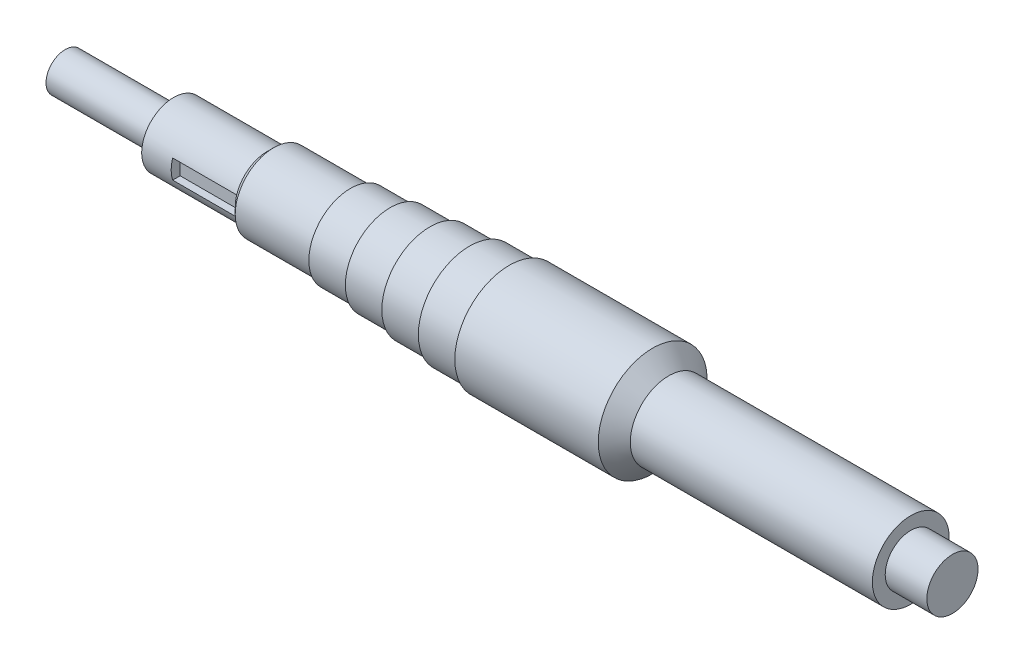
ISO-10303-21;
HEADER;
FILE_DESCRIPTION(('STEP AP214'),'2;1');
FILE_NAME('part.step','',(''),(''),'','','');
FILE_SCHEMA(('AUTOMOTIVE_DESIGN { 1 0 10303 214 1 1 1 1 }'));
ENDSEC;
DATA;
#1=APPLICATION_CONTEXT('core data for automotive mechanical design processes');
#2=APPLICATION_PROTOCOL_DEFINITION('international standard','automotive_design',2000,#1);
#3=PRODUCT_CONTEXT('',#1,'mechanical');
#4=PRODUCT('Part','Part','',(#3));
#5=PRODUCT_RELATED_PRODUCT_CATEGORY('part','',(#4));
#6=PRODUCT_DEFINITION_FORMATION('','',#4);
#7=PRODUCT_DEFINITION_CONTEXT('part definition',#1,'design');
#8=PRODUCT_DEFINITION('design','',#6,#7);
#9=PRODUCT_DEFINITION_SHAPE('','',#8);
#10=(LENGTH_UNIT() NAMED_UNIT(*) SI_UNIT(.MILLI.,.METRE.));
#11=(NAMED_UNIT(*) PLANE_ANGLE_UNIT() SI_UNIT($,.RADIAN.));
#12=(NAMED_UNIT(*) SI_UNIT($,.STERADIAN.) SOLID_ANGLE_UNIT());
#13=UNCERTAINTY_MEASURE_WITH_UNIT(LENGTH_MEASURE(1.E-05),#10,'distance_accuracy_value','');
#14=(GEOMETRIC_REPRESENTATION_CONTEXT(3) GLOBAL_UNCERTAINTY_ASSIGNED_CONTEXT((#13)) GLOBAL_UNIT_ASSIGNED_CONTEXT((#10,
#11,#12)) REPRESENTATION_CONTEXT('',''));
#15=CARTESIAN_POINT('',(0.,0.,0.));
#16=DIRECTION('',(0.,0.,1.));
#17=DIRECTION('',(1.,0.,0.));
#18=AXIS2_PLACEMENT_3D('',#15,#16,#17);
#19=CARTESIAN_POINT('',(31.55,0.,0.));
#20=DIRECTION('',(1.,0.,0.));
#21=DIRECTION('',(0.,0.,-1.));
#22=AXIS2_PLACEMENT_3D('',#19,#20,#21);
#23=CONICAL_SURFACE('',#22,4.99999999999999,0.78539816339745);
#24=CARTESIAN_POINT('',(32.55,0.,0.));
#25=DIRECTION('',(-1.,0.,0.));
#26=DIRECTION('',(0.,0.,1.));
#27=AXIS2_PLACEMENT_3D('',#24,#25,#26);
#28=CIRCLE('',#27,6.);
#29=CARTESIAN_POINT('',(32.55,0.,6.));
#30=VERTEX_POINT('',#29);
#31=EDGE_CURVE('E199',#30,#30,#28,.T.);
#32=ORIENTED_EDGE('',*,*,#31,.T.);
#33=EDGE_LOOP('',(#32));
#34=FACE_BOUND('',#33,.T.);
#35=CARTESIAN_POINT('',(31.55,0.,0.));
#36=DIRECTION('',(-1.,0.,0.));
#37=DIRECTION('',(0.,0.,1.));
#38=AXIS2_PLACEMENT_3D('',#35,#36,#37);
#39=CIRCLE('',#38,4.99999999999999);
#40=CARTESIAN_POINT('',(31.55,-1.50000000000001,4.76969600708471));
#41=VERTEX_POINT('',#40);
#42=CARTESIAN_POINT('',(31.55,1.49999999999999,4.76969600708472));
#43=VERTEX_POINT('',#42);
#44=EDGE_CURVE('E124',#41,#43,#39,.T.);
#45=ORIENTED_EDGE('',*,*,#44,.F.);
#46=EDGE_CURVE('E118',#43,#41,#39,.T.);
#47=ORIENTED_EDGE('',*,*,#46,.F.);
#48=EDGE_LOOP('',(#45,#47));
#49=FACE_BOUND('',#48,.T.);
#50=ADVANCED_FACE('F45',(#34,#49),#23,.T.);
#51=CARTESIAN_POINT('',(0.,0.,0.));
#52=DIRECTION('',(-1.,0.,0.));
#53=DIRECTION('',(0.,0.,1.));
#54=AXIS2_PLACEMENT_3D('',#51,#52,#53);
#55=CYLINDRICAL_SURFACE('',#54,6.);
#56=CARTESIAN_POINT('',(44.55,0.,0.));
#57=DIRECTION('',(-1.,0.,0.));
#58=DIRECTION('',(0.,0.,1.));
#59=AXIS2_PLACEMENT_3D('',#56,#57,#58);
#60=CIRCLE('',#59,6.);
#61=CARTESIAN_POINT('',(44.55,0.,6.));
#62=VERTEX_POINT('',#61);
#63=EDGE_CURVE('E195',#62,#62,#60,.T.);
#64=ORIENTED_EDGE('',*,*,#63,.T.);
#65=EDGE_LOOP('',(#64));
#66=FACE_BOUND('',#65,.T.);
#67=ORIENTED_EDGE('',*,*,#31,.F.);
#68=EDGE_LOOP('',(#67));
#69=FACE_BOUND('',#68,.T.);
#70=ADVANCED_FACE('F225',(#66,#69),#55,.T.);
#71=CARTESIAN_POINT('',(44.55,6.,0.));
#72=DIRECTION('',(-1.,0.,0.));
#73=DIRECTION('',(0.,0.,1.));
#74=AXIS2_PLACEMENT_3D('',#71,#72,#73);
#75=PLANE('',#74);
#76=CARTESIAN_POINT('',(44.55,0.,0.));
#77=DIRECTION('',(-1.,0.,0.));
#78=DIRECTION('',(0.,0.,1.));
#79=AXIS2_PLACEMENT_3D('',#76,#77,#78);
#80=CIRCLE('',#79,6.5);
#81=CARTESIAN_POINT('',(44.55,0.,6.5));
#82=VERTEX_POINT('',#81);
#83=EDGE_CURVE('E191',#82,#82,#80,.T.);
#84=ORIENTED_EDGE('',*,*,#83,.T.);
#85=EDGE_LOOP('',(#84));
#86=FACE_BOUND('',#85,.T.);
#87=ORIENTED_EDGE('',*,*,#63,.F.);
#88=EDGE_LOOP('',(#87));
#89=FACE_BOUND('',#88,.T.);
#90=ADVANCED_FACE('F232',(#86,#89),#75,.T.);
#91=CARTESIAN_POINT('',(0.,0.,0.));
#92=DIRECTION('',(-1.,0.,0.));
#93=DIRECTION('',(0.,0.,1.));
#94=AXIS2_PLACEMENT_3D('',#91,#92,#93);
#95=CYLINDRICAL_SURFACE('',#94,6.5);
#96=CARTESIAN_POINT('',(50.75,0.,0.));
#97=DIRECTION('',(-1.,0.,0.));
#98=DIRECTION('',(0.,0.,1.));
#99=AXIS2_PLACEMENT_3D('',#96,#97,#98);
#100=CIRCLE('',#99,6.5);
#101=CARTESIAN_POINT('',(50.75,0.,6.5));
#102=VERTEX_POINT('',#101);
#103=EDGE_CURVE('E187',#102,#102,#100,.T.);
#104=ORIENTED_EDGE('',*,*,#103,.T.);
#105=EDGE_LOOP('',(#104));
#106=FACE_BOUND('',#105,.T.);
#107=ORIENTED_EDGE('',*,*,#83,.F.);
#108=EDGE_LOOP('',(#107));
#109=FACE_BOUND('',#108,.T.);
#110=ADVANCED_FACE('F239',(#106,#109),#95,.T.);
#111=CARTESIAN_POINT('',(50.75,6.5,0.));
#112=DIRECTION('',(-1.,0.,0.));
#113=DIRECTION('',(0.,0.,1.));
#114=AXIS2_PLACEMENT_3D('',#111,#112,#113);
#115=PLANE('',#114);
#116=CARTESIAN_POINT('',(50.75,0.,0.));
#117=DIRECTION('',(-1.,0.,0.));
#118=DIRECTION('',(0.,0.,1.));
#119=AXIS2_PLACEMENT_3D('',#116,#117,#118);
#120=CIRCLE('',#119,7.);
#121=CARTESIAN_POINT('',(50.75,0.,7.));
#122=VERTEX_POINT('',#121);
#123=EDGE_CURVE('E183',#122,#122,#120,.T.);
#124=ORIENTED_EDGE('',*,*,#123,.T.);
#125=EDGE_LOOP('',(#124));
#126=FACE_BOUND('',#125,.T.);
#127=ORIENTED_EDGE('',*,*,#103,.F.);
#128=EDGE_LOOP('',(#127));
#129=FACE_BOUND('',#128,.T.);
#130=ADVANCED_FACE('F245',(#126,#129),#115,.T.);
#131=CARTESIAN_POINT('',(0.,0.,0.));
#132=DIRECTION('',(-1.,0.,0.));
#133=DIRECTION('',(0.,0.,1.));
#134=AXIS2_PLACEMENT_3D('',#131,#132,#133);
#135=CYLINDRICAL_SURFACE('',#134,7.);
#136=CARTESIAN_POINT('',(56.95,0.,0.));
#137=DIRECTION('',(-1.,0.,0.));
#138=DIRECTION('',(0.,0.,1.));
#139=AXIS2_PLACEMENT_3D('',#136,#137,#138);
#140=CIRCLE('',#139,7.);
#141=CARTESIAN_POINT('',(56.95,0.,7.));
#142=VERTEX_POINT('',#141);
#143=EDGE_CURVE('E179',#142,#142,#140,.T.);
#144=ORIENTED_EDGE('',*,*,#143,.T.);
#145=EDGE_LOOP('',(#144));
#146=FACE_BOUND('',#145,.T.);
#147=ORIENTED_EDGE('',*,*,#123,.F.);
#148=EDGE_LOOP('',(#147));
#149=FACE_BOUND('',#148,.T.);
#150=ADVANCED_FACE('F249',(#146,#149),#135,.T.);
#151=CARTESIAN_POINT('',(56.95,7.,0.));
#152=DIRECTION('',(-1.,0.,0.));
#153=DIRECTION('',(0.,0.,1.));
#154=AXIS2_PLACEMENT_3D('',#151,#152,#153);
#155=PLANE('',#154);
#156=CARTESIAN_POINT('',(56.95,0.,0.));
#157=DIRECTION('',(-1.,0.,0.));
#158=DIRECTION('',(0.,0.,1.));
#159=AXIS2_PLACEMENT_3D('',#156,#157,#158);
#160=CIRCLE('',#159,7.5);
#161=CARTESIAN_POINT('',(56.95,0.,7.5));
#162=VERTEX_POINT('',#161);
#163=EDGE_CURVE('E175',#162,#162,#160,.T.);
#164=ORIENTED_EDGE('',*,*,#163,.T.);
#165=EDGE_LOOP('',(#164));
#166=FACE_BOUND('',#165,.T.);
#167=ORIENTED_EDGE('',*,*,#143,.F.);
#168=EDGE_LOOP('',(#167));
#169=FACE_BOUND('',#168,.T.);
#170=ADVANCED_FACE('F253',(#166,#169),#155,.T.);
#171=CARTESIAN_POINT('',(0.,0.,0.));
#172=DIRECTION('',(-1.,0.,0.));
#173=DIRECTION('',(0.,0.,1.));
#174=AXIS2_PLACEMENT_3D('',#171,#172,#173);
#175=CYLINDRICAL_SURFACE('',#174,7.5);
#176=CARTESIAN_POINT('',(63.15,0.,0.));
#177=DIRECTION('',(-1.,0.,0.));
#178=DIRECTION('',(0.,0.,1.));
#179=AXIS2_PLACEMENT_3D('',#176,#177,#178);
#180=CIRCLE('',#179,7.5);
#181=CARTESIAN_POINT('',(63.15,0.,7.5));
#182=VERTEX_POINT('',#181);
#183=EDGE_CURVE('E171',#182,#182,#180,.T.);
#184=ORIENTED_EDGE('',*,*,#183,.T.);
#185=EDGE_LOOP('',(#184));
#186=FACE_BOUND('',#185,.T.);
#187=ORIENTED_EDGE('',*,*,#163,.F.);
#188=EDGE_LOOP('',(#187));
#189=FACE_BOUND('',#188,.T.);
#190=ADVANCED_FACE('F257',(#186,#189),#175,.T.);
#191=CARTESIAN_POINT('',(63.15,7.5,0.));
#192=DIRECTION('',(-1.,0.,0.));
#193=DIRECTION('',(0.,0.,1.));
#194=AXIS2_PLACEMENT_3D('',#191,#192,#193);
#195=PLANE('',#194);
#196=CARTESIAN_POINT('',(63.15,0.,0.));
#197=DIRECTION('',(-1.,0.,0.));
#198=DIRECTION('',(0.,0.,1.));
#199=AXIS2_PLACEMENT_3D('',#196,#197,#198);
#200=CIRCLE('',#199,8.);
#201=CARTESIAN_POINT('',(63.15,0.,8.));
#202=VERTEX_POINT('',#201);
#203=EDGE_CURVE('E167',#202,#202,#200,.T.);
#204=ORIENTED_EDGE('',*,*,#203,.T.);
#205=EDGE_LOOP('',(#204));
#206=FACE_BOUND('',#205,.T.);
#207=ORIENTED_EDGE('',*,*,#183,.F.);
#208=EDGE_LOOP('',(#207));
#209=FACE_BOUND('',#208,.T.);
#210=ADVANCED_FACE('F261',(#206,#209),#195,.T.);
#211=CARTESIAN_POINT('',(0.,0.,0.));
#212=DIRECTION('',(-1.,0.,0.));
#213=DIRECTION('',(0.,0.,1.));
#214=AXIS2_PLACEMENT_3D('',#211,#212,#213);
#215=CYLINDRICAL_SURFACE('',#214,8.);
#216=CARTESIAN_POINT('',(69.35,0.,0.));
#217=DIRECTION('',(-1.,0.,0.));
#218=DIRECTION('',(0.,0.,1.));
#219=AXIS2_PLACEMENT_3D('',#216,#217,#218);
#220=CIRCLE('',#219,8.);
#221=CARTESIAN_POINT('',(69.35,0.,8.));
#222=VERTEX_POINT('',#221);
#223=EDGE_CURVE('E163',#222,#222,#220,.T.);
#224=ORIENTED_EDGE('',*,*,#223,.T.);
#225=EDGE_LOOP('',(#224));
#226=FACE_BOUND('',#225,.T.);
#227=ORIENTED_EDGE('',*,*,#203,.F.);
#228=EDGE_LOOP('',(#227));
#229=FACE_BOUND('',#228,.T.);
#230=ADVANCED_FACE('F265',(#226,#229),#215,.T.);
#231=CARTESIAN_POINT('',(69.35,8.5,0.));
#232=DIRECTION('',(1.,0.,0.));
#233=DIRECTION('',(0.,0.,-1.));
#234=AXIS2_PLACEMENT_3D('',#231,#232,#233);
#235=PLANE('',#234);
#236=ORIENTED_EDGE('',*,*,#223,.F.);
#237=EDGE_LOOP('',(#236));
#238=FACE_BOUND('',#237,.T.);
#239=CARTESIAN_POINT('',(69.35,0.,0.));
#240=DIRECTION('',(-1.,0.,0.));
#241=DIRECTION('',(0.,0.,1.));
#242=AXIS2_PLACEMENT_3D('',#239,#240,#241);
#243=CIRCLE('',#242,8.5);
#244=CARTESIAN_POINT('',(69.35,0.,8.5));
#245=VERTEX_POINT('',#244);
#246=EDGE_CURVE('E159',#245,#245,#243,.T.);
#247=ORIENTED_EDGE('',*,*,#246,.T.);
#248=EDGE_LOOP('',(#247));
#249=FACE_BOUND('',#248,.T.);
#250=ADVANCED_FACE('F269',(#238,#249),#235,.F.);
#251=CARTESIAN_POINT('',(0.,0.,0.));
#252=DIRECTION('',(-1.,0.,0.));
#253=DIRECTION('',(0.,0.,1.));
#254=AXIS2_PLACEMENT_3D('',#251,#252,#253);
#255=CYLINDRICAL_SURFACE('',#254,8.5);
#256=CARTESIAN_POINT('',(91.75,0.,0.));
#257=DIRECTION('',(-1.,0.,0.));
#258=DIRECTION('',(0.,0.,1.));
#259=AXIS2_PLACEMENT_3D('',#256,#257,#258);
#260=CIRCLE('',#259,8.5);
#261=CARTESIAN_POINT('',(91.75,0.,8.5));
#262=VERTEX_POINT('',#261);
#263=EDGE_CURVE('E155',#262,#262,#260,.T.);
#264=ORIENTED_EDGE('',*,*,#263,.T.);
#265=EDGE_LOOP('',(#264));
#266=FACE_BOUND('',#265,.T.);
#267=ORIENTED_EDGE('',*,*,#246,.F.);
#268=EDGE_LOOP('',(#267));
#269=FACE_BOUND('',#268,.T.);
#270=ADVANCED_FACE('F273',(#266,#269),#255,.T.);
#271=CARTESIAN_POINT('',(91.75,0.,0.));
#272=DIRECTION('',(-1.,0.,0.));
#273=DIRECTION('',(0.,0.,1.));
#274=AXIS2_PLACEMENT_3D('',#271,#272,#273);
#275=CONICAL_SURFACE('',#274,8.5,0.785398163397453);
#276=CARTESIAN_POINT('',(94.25,0.,0.));
#277=DIRECTION('',(-1.,0.,0.));
#278=DIRECTION('',(0.,0.,1.));
#279=AXIS2_PLACEMENT_3D('',#276,#277,#278);
#280=CIRCLE('',#279,6.);
#281=CARTESIAN_POINT('',(94.25,0.,6.));
#282=VERTEX_POINT('',#281);
#283=EDGE_CURVE('E151',#282,#282,#280,.T.);
#284=ORIENTED_EDGE('',*,*,#283,.T.);
#285=EDGE_LOOP('',(#284));
#286=FACE_BOUND('',#285,.T.);
#287=ORIENTED_EDGE('',*,*,#263,.F.);
#288=EDGE_LOOP('',(#287));
#289=FACE_BOUND('',#288,.T.);
#290=ADVANCED_FACE('F277',(#286,#289),#275,.T.);
#291=CARTESIAN_POINT('',(0.,0.,0.));
#292=DIRECTION('',(-1.,0.,0.));
#293=DIRECTION('',(0.,0.,1.));
#294=AXIS2_PLACEMENT_3D('',#291,#292,#293);
#295=CYLINDRICAL_SURFACE('',#294,6.);
#296=CARTESIAN_POINT('',(132.06,0.,0.));
#297=DIRECTION('',(-1.,0.,0.));
#298=DIRECTION('',(0.,0.,1.));
#299=AXIS2_PLACEMENT_3D('',#296,#297,#298);
#300=CIRCLE('',#299,6.);
#301=CARTESIAN_POINT('',(132.06,0.,6.));
#302=VERTEX_POINT('',#301);
#303=EDGE_CURVE('E147',#302,#302,#300,.T.);
#304=ORIENTED_EDGE('',*,*,#303,.T.);
#305=EDGE_LOOP('',(#304));
#306=FACE_BOUND('',#305,.T.);
#307=ORIENTED_EDGE('',*,*,#283,.F.);
#308=EDGE_LOOP('',(#307));
#309=FACE_BOUND('',#308,.T.);
#310=ADVANCED_FACE('F281',(#306,#309),#295,.T.);
#311=CARTESIAN_POINT('',(132.06,6.,0.));
#312=DIRECTION('',(1.,0.,0.));
#313=DIRECTION('',(0.,0.,-1.));
#314=AXIS2_PLACEMENT_3D('',#311,#312,#313);
#315=PLANE('',#314);
#316=CARTESIAN_POINT('',(132.06,0.,0.));
#317=DIRECTION('',(-1.,0.,0.));
#318=DIRECTION('',(0.,0.,1.));
#319=AXIS2_PLACEMENT_3D('',#316,#317,#318);
#320=CIRCLE('',#319,4.);
#321=CARTESIAN_POINT('',(132.06,0.,4.));
#322=VERTEX_POINT('',#321);
#323=EDGE_CURVE('E143',#322,#322,#320,.T.);
#324=ORIENTED_EDGE('',*,*,#323,.T.);
#325=EDGE_LOOP('',(#324));
#326=FACE_BOUND('',#325,.T.);
#327=ORIENTED_EDGE('',*,*,#303,.F.);
#328=EDGE_LOOP('',(#327));
#329=FACE_BOUND('',#328,.T.);
#330=ADVANCED_FACE('F285',(#326,#329),#315,.T.);
#331=CARTESIAN_POINT('',(0.,0.,0.));
#332=DIRECTION('',(-1.,0.,0.));
#333=DIRECTION('',(0.,0.,1.));
#334=AXIS2_PLACEMENT_3D('',#331,#332,#333);
#335=CYLINDRICAL_SURFACE('',#334,4.);
#336=CARTESIAN_POINT('',(138.56,0.,0.));
#337=DIRECTION('',(-1.,0.,0.));
#338=DIRECTION('',(0.,0.,1.));
#339=AXIS2_PLACEMENT_3D('',#336,#337,#338);
#340=CIRCLE('',#339,4.);
#341=CARTESIAN_POINT('',(138.56,0.,4.));
#342=VERTEX_POINT('',#341);
#343=EDGE_CURVE('E139',#342,#342,#340,.T.);
#344=ORIENTED_EDGE('',*,*,#343,.T.);
#345=EDGE_LOOP('',(#344));
#346=FACE_BOUND('',#345,.T.);
#347=ORIENTED_EDGE('',*,*,#323,.F.);
#348=EDGE_LOOP('',(#347));
#349=FACE_BOUND('',#348,.T.);
#350=ADVANCED_FACE('F289',(#346,#349),#335,.T.);
#351=CARTESIAN_POINT('',(138.56,4.,0.));
#352=DIRECTION('',(1.,0.,0.));
#353=DIRECTION('',(0.,0.,-1.));
#354=AXIS2_PLACEMENT_3D('',#351,#352,#353);
#355=PLANE('',#354);
#356=ORIENTED_EDGE('',*,*,#343,.F.);
#357=EDGE_LOOP('',(#356));
#358=FACE_BOUND('',#357,.T.);
#359=ADVANCED_FACE('F293',(#358),#355,.T.);
#360=CARTESIAN_POINT('',(0.,0.,0.));
#361=DIRECTION('',(-1.,0.,0.));
#362=DIRECTION('',(0.,0.,1.));
#363=AXIS2_PLACEMENT_3D('',#360,#361,#362);
#364=PLANE('',#363);
#365=CARTESIAN_POINT('',(0.,0.,0.));
#366=DIRECTION('',(-1.,0.,0.));
#367=DIRECTION('',(0.,0.,1.));
#368=AXIS2_PLACEMENT_3D('',#365,#366,#367);
#369=CIRCLE('',#368,3.);
#370=CARTESIAN_POINT('',(0.,0.,3.));
#371=VERTEX_POINT('',#370);
#372=EDGE_CURVE('E135',#371,#371,#369,.T.);
#373=ORIENTED_EDGE('',*,*,#372,.T.);
#374=EDGE_LOOP('',(#373));
#375=FACE_BOUND('',#374,.T.);
#376=ADVANCED_FACE('F297',(#375),#364,.T.);
#377=CARTESIAN_POINT('',(0.,0.,0.));
#378=DIRECTION('',(-1.,0.,0.));
#379=DIRECTION('',(0.,0.,1.));
#380=AXIS2_PLACEMENT_3D('',#377,#378,#379);
#381=CYLINDRICAL_SURFACE('',#380,3.);
#382=CARTESIAN_POINT('',(16.94,0.,0.));
#383=DIRECTION('',(-1.,0.,0.));
#384=DIRECTION('',(0.,0.,1.));
#385=AXIS2_PLACEMENT_3D('',#382,#383,#384);
#386=CIRCLE('',#385,3.);
#387=CARTESIAN_POINT('',(16.94,0.,3.));
#388=VERTEX_POINT('',#387);
#389=EDGE_CURVE('E131',#388,#388,#386,.T.);
#390=ORIENTED_EDGE('',*,*,#389,.T.);
#391=EDGE_LOOP('',(#390));
#392=FACE_BOUND('',#391,.T.);
#393=ORIENTED_EDGE('',*,*,#372,.F.);
#394=EDGE_LOOP('',(#393));
#395=FACE_BOUND('',#394,.T.);
#396=ADVANCED_FACE('F301',(#392,#395),#381,.T.);
#397=CARTESIAN_POINT('',(16.94,3.,0.));
#398=DIRECTION('',(-1.,0.,0.));
#399=DIRECTION('',(0.,0.,1.));
#400=AXIS2_PLACEMENT_3D('',#397,#398,#399);
#401=PLANE('',#400);
#402=CARTESIAN_POINT('',(16.94,0.,0.));
#403=DIRECTION('',(-1.,0.,0.));
#404=DIRECTION('',(0.,0.,1.));
#405=AXIS2_PLACEMENT_3D('',#402,#403,#404);
#406=CIRCLE('',#405,4.99999999999999);
#407=CARTESIAN_POINT('',(16.94,0.,4.99999999999999));
#408=VERTEX_POINT('',#407);
#409=EDGE_CURVE('E127',#408,#408,#406,.T.);
#410=ORIENTED_EDGE('',*,*,#409,.T.);
#411=EDGE_LOOP('',(#410));
#412=FACE_BOUND('',#411,.T.);
#413=ORIENTED_EDGE('',*,*,#389,.F.);
#414=EDGE_LOOP('',(#413));
#415=FACE_BOUND('',#414,.T.);
#416=ADVANCED_FACE('F305',(#412,#415),#401,.T.);
#417=CARTESIAN_POINT('',(0.,0.,0.));
#418=DIRECTION('',(-1.,0.,0.));
#419=DIRECTION('',(0.,0.,1.));
#420=AXIS2_PLACEMENT_3D('',#417,#418,#419);
#421=CYLINDRICAL_SURFACE('',#420,4.99999999999999);
#422=DIRECTION('',(-1.,0.,0.));
#423=VECTOR('',#422,1.);
#424=CARTESIAN_POINT('',(0.,-1.50000000000001,4.76969600708471));
#425=LINE('',#424,#423);
#426=CARTESIAN_POINT('',(21.55,-1.50000000000001,4.76969600708471));
#427=VERTEX_POINT('',#426);
#428=EDGE_CURVE('E11',#427,#41,#425,.F.);
#429=ORIENTED_EDGE('',*,*,#428,.F.);
#430=CARTESIAN_POINT('',(21.55,0.,0.));
#431=DIRECTION('',(-1.,0.,0.));
#432=DIRECTION('',(0.,0.,1.));
#433=AXIS2_PLACEMENT_3D('',#430,#431,#432);
#434=CIRCLE('',#433,4.99999999999999);
#435=CARTESIAN_POINT('',(21.55,1.49999999999999,4.76969600708472));
#436=VERTEX_POINT('',#435);
#437=EDGE_CURVE('E60',#436,#427,#434,.F.);
#438=ORIENTED_EDGE('',*,*,#437,.F.);
#439=DIRECTION('',(-1.,0.,0.));
#440=VECTOR('',#439,1.);
#441=CARTESIAN_POINT('',(0.,1.49999999999999,4.76969600708472));
#442=LINE('',#441,#440);
#443=EDGE_CURVE('E53',#43,#436,#442,.T.);
#444=ORIENTED_EDGE('',*,*,#443,.F.);
#445=ORIENTED_EDGE('',*,*,#46,.T.);
#446=EDGE_LOOP('',(#429,#438,#444,#445));
#447=FACE_BOUND('',#446,.T.);
#448=ORIENTED_EDGE('',*,*,#409,.F.);
#449=EDGE_LOOP('',(#448));
#450=FACE_BOUND('',#449,.T.);
#451=ADVANCED_FACE('F209',(#447,#450),#421,.T.);
#452=CARTESIAN_POINT('',(21.55,1.49999999999999,3.6));
#453=DIRECTION('',(-1.,0.,0.));
#454=DIRECTION('',(0.,0.,1.));
#455=AXIS2_PLACEMENT_3D('',#452,#453,#454);
#456=PLANE('',#455);
#457=ORIENTED_EDGE('',*,*,#437,.T.);
#458=DIRECTION('',(0.,0.,1.));
#459=VECTOR('',#458,1.);
#460=CARTESIAN_POINT('',(21.55,-1.50000000000001,3.6));
#461=LINE('',#460,#459);
#462=CARTESIAN_POINT('',(21.55,-1.50000000000001,3.6));
#463=VERTEX_POINT('',#462);
#464=EDGE_CURVE('E84',#463,#427,#461,.T.);
#465=ORIENTED_EDGE('',*,*,#464,.F.);
#466=DIRECTION('',(0.,-1.,0.));
#467=VECTOR('',#466,1.);
#468=CARTESIAN_POINT('',(21.55,1.49999999999999,3.6));
#469=LINE('',#468,#467);
#470=CARTESIAN_POINT('',(21.55,1.49999999999999,3.6));
#471=VERTEX_POINT('',#470);
#472=EDGE_CURVE('E88',#471,#463,#469,.T.);
#473=ORIENTED_EDGE('',*,*,#472,.F.);
#474=DIRECTION('',(0.,0.,1.));
#475=VECTOR('',#474,1.);
#476=CARTESIAN_POINT('',(21.55,1.49999999999999,3.6));
#477=LINE('',#476,#475);
#478=EDGE_CURVE('E115',#471,#436,#477,.T.);
#479=ORIENTED_EDGE('',*,*,#478,.T.);
#480=EDGE_LOOP('',(#457,#465,#473,#479));
#481=FACE_BOUND('',#480,.T.);
#482=ADVANCED_FACE('F86',(#481),#456,.F.);
#483=CARTESIAN_POINT('',(21.55,1.49999999999999,3.6));
#484=DIRECTION('',(0.,1.,0.));
#485=DIRECTION('',(0.,0.,1.));
#486=AXIS2_PLACEMENT_3D('',#483,#484,#485);
#487=PLANE('',#486);
#488=ORIENTED_EDGE('',*,*,#443,.T.);
#489=ORIENTED_EDGE('',*,*,#478,.F.);
#490=DIRECTION('',(-1.,0.,0.));
#491=VECTOR('',#490,1.);
#492=CARTESIAN_POINT('',(21.55,1.49999999999999,3.6));
#493=LINE('',#492,#491);
#494=CARTESIAN_POINT('',(31.55,1.49999999999999,3.6));
#495=VERTEX_POINT('',#494);
#496=EDGE_CURVE('E94',#495,#471,#493,.T.);
#497=ORIENTED_EDGE('',*,*,#496,.F.);
#498=DIRECTION('',(0.,0.,1.));
#499=VECTOR('',#498,1.);
#500=CARTESIAN_POINT('',(31.55,1.49999999999999,3.6));
#501=LINE('',#500,#499);
#502=EDGE_CURVE('E119',#495,#43,#501,.T.);
#503=ORIENTED_EDGE('',*,*,#502,.T.);
#504=EDGE_LOOP('',(#488,#489,#497,#503));
#505=FACE_BOUND('',#504,.T.);
#506=ADVANCED_FACE('F214',(#505),#487,.F.);
#507=CARTESIAN_POINT('',(31.55,1.49999999999999,3.6));
#508=DIRECTION('',(1.,0.,0.));
#509=DIRECTION('',(0.,0.,-1.));
#510=AXIS2_PLACEMENT_3D('',#507,#508,#509);
#511=PLANE('',#510);
#512=DIRECTION('',(0.,0.,1.));
#513=VECTOR('',#512,1.);
#514=CARTESIAN_POINT('',(31.55,-1.50000000000001,3.6));
#515=LINE('',#514,#513);
#516=CARTESIAN_POINT('',(31.55,-1.50000000000001,3.6));
#517=VERTEX_POINT('',#516);
#518=EDGE_CURVE('E93',#517,#41,#515,.T.);
#519=ORIENTED_EDGE('',*,*,#518,.T.);
#520=ORIENTED_EDGE('',*,*,#44,.T.);
#521=ORIENTED_EDGE('',*,*,#502,.F.);
#522=DIRECTION('',(0.,1.,0.));
#523=VECTOR('',#522,1.);
#524=CARTESIAN_POINT('',(31.55,1.49999999999999,3.6));
#525=LINE('',#524,#523);
#526=EDGE_CURVE('E104',#517,#495,#525,.T.);
#527=ORIENTED_EDGE('',*,*,#526,.F.);
#528=EDGE_LOOP('',(#519,#520,#521,#527));
#529=FACE_BOUND('',#528,.T.);
#530=ADVANCED_FACE('F213',(#529),#511,.F.);
#531=CARTESIAN_POINT('',(21.55,-1.50000000000001,3.6));
#532=DIRECTION('',(0.,-1.,0.));
#533=DIRECTION('',(1.,0.,0.));
#534=AXIS2_PLACEMENT_3D('',#531,#532,#533);
#535=PLANE('',#534);
#536=ORIENTED_EDGE('',*,*,#428,.T.);
#537=ORIENTED_EDGE('',*,*,#518,.F.);
#538=DIRECTION('',(1.,0.,0.));
#539=VECTOR('',#538,1.);
#540=CARTESIAN_POINT('',(21.55,-1.50000000000001,3.6));
#541=LINE('',#540,#539);
#542=EDGE_CURVE('E97',#463,#517,#541,.T.);
#543=ORIENTED_EDGE('',*,*,#542,.F.);
#544=ORIENTED_EDGE('',*,*,#464,.T.);
#545=EDGE_LOOP('',(#536,#537,#543,#544));
#546=FACE_BOUND('',#545,.T.);
#547=ADVANCED_FACE('F98',(#546),#535,.F.);
#548=CARTESIAN_POINT('',(0.,0.,3.6));
#549=DIRECTION('',(0.,0.,1.));
#550=DIRECTION('',(1.,0.,0.));
#551=AXIS2_PLACEMENT_3D('',#548,#549,#550);
#552=PLANE('',#551);
#553=ORIENTED_EDGE('',*,*,#472,.T.);
#554=ORIENTED_EDGE('',*,*,#542,.T.);
#555=ORIENTED_EDGE('',*,*,#526,.T.);
#556=ORIENTED_EDGE('',*,*,#496,.T.);
#557=EDGE_LOOP('',(#553,#554,#555,#556));
#558=FACE_BOUND('',#557,.T.);
#559=ADVANCED_FACE('F106',(#558),#552,.T.);
#560=CLOSED_SHELL('',(#50,#70,#90,#110,#130,#150,#170,#190,#210,#230,#250,#270,#290,#310,#330,
#350,#359,#376,#396,#416,#451,#482,#506,#530,#547,#559));
#561=MANIFOLD_SOLID_BREP('B2',#560);
#562=ADVANCED_BREP_SHAPE_REPRESENTATION('',(#18,#561),#14);
#563=SHAPE_DEFINITION_REPRESENTATION(#9,#562);
ENDSEC;
END-ISO-10303-21;
